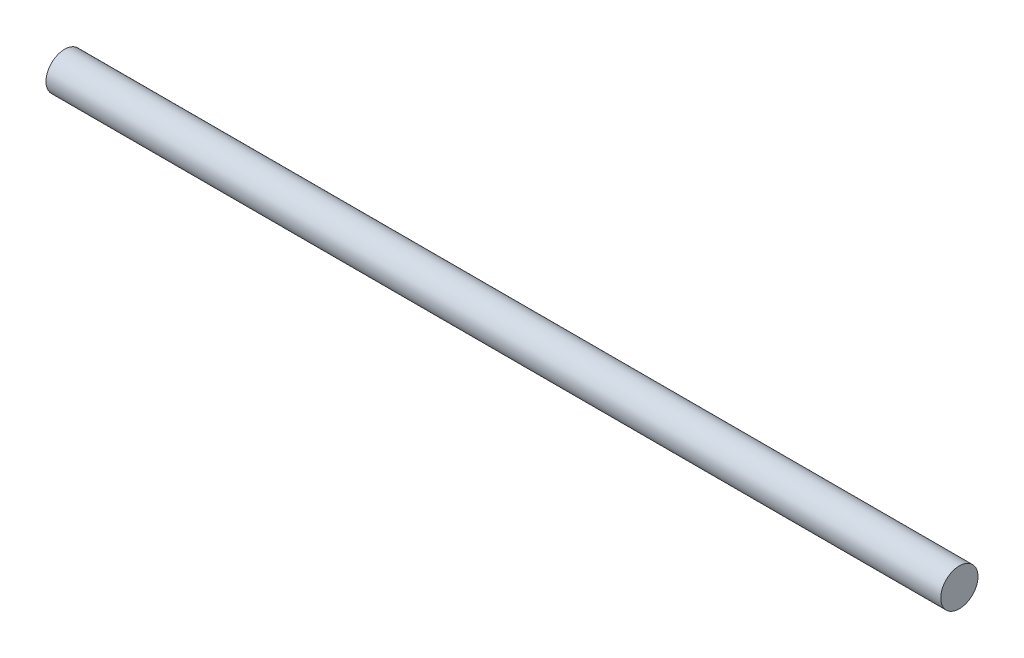
ISO-10303-21;
HEADER;
FILE_DESCRIPTION(('STEP AP214'),'2;1');
FILE_NAME('part.step','',(''),(''),'','','');
FILE_SCHEMA(('AUTOMOTIVE_DESIGN { 1 0 10303 214 1 1 1 1 }'));
ENDSEC;
DATA;
#1=APPLICATION_CONTEXT('core data for automotive mechanical design processes');
#2=APPLICATION_PROTOCOL_DEFINITION('international standard','automotive_design',2000,#1);
#3=PRODUCT_CONTEXT('',#1,'mechanical');
#4=PRODUCT('Part','Part','',(#3));
#5=PRODUCT_RELATED_PRODUCT_CATEGORY('part','',(#4));
#6=PRODUCT_DEFINITION_FORMATION('','',#4);
#7=PRODUCT_DEFINITION_CONTEXT('part definition',#1,'design');
#8=PRODUCT_DEFINITION('design','',#6,#7);
#9=PRODUCT_DEFINITION_SHAPE('','',#8);
#10=(LENGTH_UNIT() NAMED_UNIT(*) SI_UNIT(.MILLI.,.METRE.));
#11=(NAMED_UNIT(*) PLANE_ANGLE_UNIT() SI_UNIT($,.RADIAN.));
#12=(NAMED_UNIT(*) SI_UNIT($,.STERADIAN.) SOLID_ANGLE_UNIT());
#13=UNCERTAINTY_MEASURE_WITH_UNIT(LENGTH_MEASURE(1.E-05),#10,'distance_accuracy_value','');
#14=(GEOMETRIC_REPRESENTATION_CONTEXT(3) GLOBAL_UNCERTAINTY_ASSIGNED_CONTEXT((#13)) GLOBAL_UNIT_ASSIGNED_CONTEXT((#10,
#11,#12)) REPRESENTATION_CONTEXT('',''));
#15=CARTESIAN_POINT('',(0.,0.,0.));
#16=DIRECTION('',(0.,0.,1.));
#17=DIRECTION('',(1.,0.,0.));
#18=AXIS2_PLACEMENT_3D('',#15,#16,#17);
#19=CARTESIAN_POINT('',(120.,0.,0.));
#20=DIRECTION('',(-1.,0.,0.));
#21=DIRECTION('',(0.,0.,1.));
#22=AXIS2_PLACEMENT_3D('',#19,#20,#21);
#23=CYLINDRICAL_SURFACE('',#22,2.5);
#24=CARTESIAN_POINT('',(120.,0.,0.));
#25=DIRECTION('',(1.,0.,0.));
#26=DIRECTION('',(0.,0.,-1.));
#27=AXIS2_PLACEMENT_3D('',#24,#25,#26);
#28=CIRCLE('',#27,2.5);
#29=CARTESIAN_POINT('',(120.,0.,-2.5));
#30=VERTEX_POINT('',#29);
#31=EDGE_CURVE('E10',#30,#30,#28,.T.);
#32=ORIENTED_EDGE('',*,*,#31,.F.);
#33=EDGE_LOOP('',(#32));
#34=FACE_BOUND('',#33,.T.);
#35=CARTESIAN_POINT('',(0.,0.,0.));
#36=DIRECTION('',(1.,0.,0.));
#37=DIRECTION('',(0.,0.,-1.));
#38=AXIS2_PLACEMENT_3D('',#35,#36,#37);
#39=CIRCLE('',#38,2.5);
#40=CARTESIAN_POINT('',(0.,0.,-2.5));
#41=VERTEX_POINT('',#40);
#42=EDGE_CURVE('E36',#41,#41,#39,.T.);
#43=ORIENTED_EDGE('',*,*,#42,.T.);
#44=EDGE_LOOP('',(#43));
#45=FACE_BOUND('',#44,.T.);
#46=ADVANCED_FACE('F33',(#34,#45),#23,.T.);
#47=CARTESIAN_POINT('',(120.,0.,0.));
#48=DIRECTION('',(1.,0.,0.));
#49=DIRECTION('',(0.,0.,-1.));
#50=AXIS2_PLACEMENT_3D('',#47,#48,#49);
#51=PLANE('',#50);
#52=ORIENTED_EDGE('',*,*,#31,.T.);
#53=EDGE_LOOP('',(#52));
#54=FACE_BOUND('',#53,.T.);
#55=ADVANCED_FACE('F48',(#54),#51,.T.);
#56=CARTESIAN_POINT('',(0.,0.,0.));
#57=DIRECTION('',(1.,0.,0.));
#58=DIRECTION('',(0.,0.,-1.));
#59=AXIS2_PLACEMENT_3D('',#56,#57,#58);
#60=PLANE('',#59);
#61=ORIENTED_EDGE('',*,*,#42,.F.);
#62=EDGE_LOOP('',(#61));
#63=FACE_BOUND('',#62,.T.);
#64=ADVANCED_FACE('F46',(#63),#60,.F.);
#65=CLOSED_SHELL('',(#46,#55,#64));
#66=MANIFOLD_SOLID_BREP('B2',#65);
#67=ADVANCED_BREP_SHAPE_REPRESENTATION('',(#18,#66),#14);
#68=SHAPE_DEFINITION_REPRESENTATION(#9,#67);
ENDSEC;
END-ISO-10303-21;
